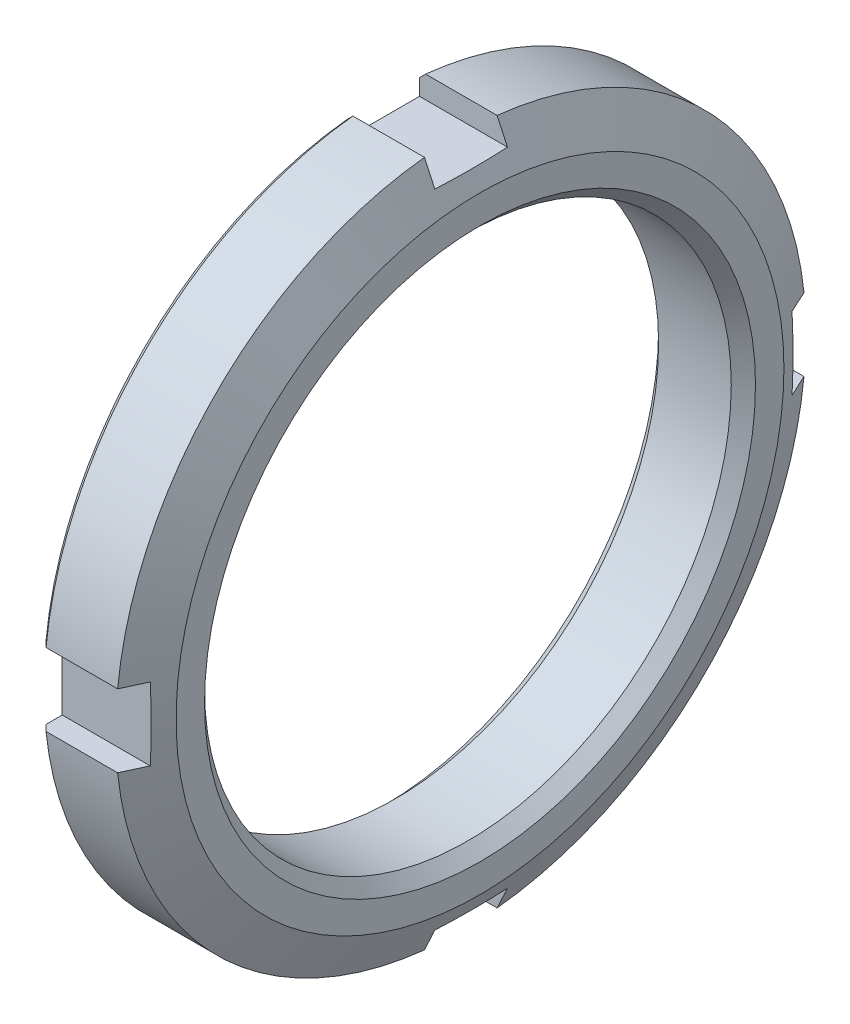
ISO-10303-21;
HEADER;
FILE_DESCRIPTION(('STEP AP214'),'2;1');
FILE_NAME('part.step','',(''),(''),'','','');
FILE_SCHEMA(('AUTOMOTIVE_DESIGN { 1 0 10303 214 1 1 1 1 }'));
ENDSEC;
DATA;
#1=APPLICATION_CONTEXT('core data for automotive mechanical design processes');
#2=APPLICATION_PROTOCOL_DEFINITION('international standard','automotive_design',2000,#1);
#3=PRODUCT_CONTEXT('',#1,'mechanical');
#4=PRODUCT('Part','Part','',(#3));
#5=PRODUCT_RELATED_PRODUCT_CATEGORY('part','',(#4));
#6=PRODUCT_DEFINITION_FORMATION('','',#4);
#7=PRODUCT_DEFINITION_CONTEXT('part definition',#1,'design');
#8=PRODUCT_DEFINITION('design','',#6,#7);
#9=PRODUCT_DEFINITION_SHAPE('','',#8);
#10=(LENGTH_UNIT() NAMED_UNIT(*) SI_UNIT(.MILLI.,.METRE.));
#11=(NAMED_UNIT(*) PLANE_ANGLE_UNIT() SI_UNIT($,.RADIAN.));
#12=(NAMED_UNIT(*) SI_UNIT($,.STERADIAN.) SOLID_ANGLE_UNIT());
#13=UNCERTAINTY_MEASURE_WITH_UNIT(LENGTH_MEASURE(1.E-05),#10,'distance_accuracy_value','');
#14=(GEOMETRIC_REPRESENTATION_CONTEXT(3) GLOBAL_UNCERTAINTY_ASSIGNED_CONTEXT((#13)) GLOBAL_UNIT_ASSIGNED_CONTEXT((#10,
#11,#12)) REPRESENTATION_CONTEXT('',''));
#15=CARTESIAN_POINT('',(0.,0.,0.));
#16=DIRECTION('',(0.,0.,1.));
#17=DIRECTION('',(1.,0.,0.));
#18=AXIS2_PLACEMENT_3D('',#15,#16,#17);
#19=CARTESIAN_POINT('',(8.,0.,0.));
#20=DIRECTION('',(1.,0.,0.));
#21=DIRECTION('',(0.,0.,-1.));
#22=AXIS2_PLACEMENT_3D('',#19,#20,#21);
#23=PLANE('',#22);
#24=CARTESIAN_POINT('',(8.,0.,0.));
#25=DIRECTION('',(1.,0.,0.));
#26=DIRECTION('',(0.,0.,-1.));
#27=AXIS2_PLACEMENT_3D('',#24,#25,#26);
#28=CIRCLE('',#27,22.75);
#29=CARTESIAN_POINT('',(8.,0.,-22.75));
#30=VERTEX_POINT('',#29);
#31=EDGE_CURVE('E282',#30,#30,#28,.F.);
#32=ORIENTED_EDGE('',*,*,#31,.T.);
#33=EDGE_LOOP('',(#32));
#34=FACE_BOUND('',#33,.T.);
#35=CARTESIAN_POINT('',(8.,0.,0.));
#36=DIRECTION('',(1.,0.,0.));
#37=DIRECTION('',(0.,0.,-1.));
#38=AXIS2_PLACEMENT_3D('',#35,#36,#37);
#39=CIRCLE('',#38,25.1);
#40=CARTESIAN_POINT('',(8.,0.,-25.1));
#41=VERTEX_POINT('',#40);
#42=EDGE_CURVE('E743',#41,#41,#39,.T.);
#43=ORIENTED_EDGE('',*,*,#42,.T.);
#44=EDGE_LOOP('',(#43));
#45=FACE_BOUND('',#44,.T.);
#46=ADVANCED_FACE('F39',(#34,#45),#23,.T.);
#47=CARTESIAN_POINT('',(8.,0.,0.));
#48=DIRECTION('',(-1.,0.,0.));
#49=DIRECTION('',(0.,0.,1.));
#50=AXIS2_PLACEMENT_3D('',#47,#48,#49);
#51=CYLINDRICAL_SURFACE('',#50,28.5);
#52=DIRECTION('',(1.,0.,0.));
#53=VECTOR('',#52,1.);
#54=CARTESIAN_POINT('',(0.,-3.0000000000001,-28.3416654415368));
#55=LINE('',#54,#53);
#56=CARTESIAN_POINT('',(0.499999999999997,-3.0000000000001,-28.3416654415368));
#57=VERTEX_POINT('',#56);
#58=CARTESIAN_POINT('',(6.41455396227303,-3.0000000000001,-28.3416654415368));
#59=VERTEX_POINT('',#58);
#60=EDGE_CURVE('E257',#57,#59,#55,.T.);
#61=ORIENTED_EDGE('',*,*,#60,.T.);
#62=CARTESIAN_POINT('',(6.41455396227303,0.,0.));
#63=DIRECTION('',(-1.,0.,0.));
#64=DIRECTION('',(0.,0.,1.));
#65=AXIS2_PLACEMENT_3D('',#62,#63,#64);
#66=CIRCLE('',#65,28.5);
#67=CARTESIAN_POINT('',(6.41455396227303,-28.3416654415368,-3.));
#68=VERTEX_POINT('',#67);
#69=EDGE_CURVE('E195',#59,#68,#66,.T.);
#70=ORIENTED_EDGE('',*,*,#69,.T.);
#71=DIRECTION('',(1.,0.,0.));
#72=VECTOR('',#71,1.);
#73=CARTESIAN_POINT('',(0.,-28.3416654415368,-3.));
#74=LINE('',#73,#72);
#75=CARTESIAN_POINT('',(0.499999999999997,-28.3416654415368,-3.));
#76=VERTEX_POINT('',#75);
#77=EDGE_CURVE('E221',#76,#68,#74,.T.);
#78=ORIENTED_EDGE('',*,*,#77,.F.);
#79=CARTESIAN_POINT('',(0.499999999999997,0.,0.));
#80=DIRECTION('',(1.,0.,0.));
#81=DIRECTION('',(0.,0.,-1.));
#82=AXIS2_PLACEMENT_3D('',#79,#80,#81);
#83=CIRCLE('',#82,28.5);
#84=EDGE_CURVE('E740',#76,#57,#83,.T.);
#85=ORIENTED_EDGE('',*,*,#84,.T.);
#86=EDGE_LOOP('',(#61,#70,#78,#85));
#87=FACE_BOUND('',#86,.T.);
#88=ADVANCED_FACE('F439',(#87),#51,.T.);
#89=DIRECTION('',(1.,0.,0.));
#90=VECTOR('',#89,1.);
#91=CARTESIAN_POINT('',(0.,-28.3416654415368,3.));
#92=LINE('',#91,#90);
#93=CARTESIAN_POINT('',(0.499999999999997,-28.3416654415368,3.));
#94=VERTEX_POINT('',#93);
#95=CARTESIAN_POINT('',(6.41455396227303,-28.3416654415368,3.));
#96=VERTEX_POINT('',#95);
#97=EDGE_CURVE('E222',#94,#96,#92,.T.);
#98=ORIENTED_EDGE('',*,*,#97,.T.);
#99=CARTESIAN_POINT('',(6.41455396227303,0.,0.));
#100=DIRECTION('',(-1.,0.,0.));
#101=DIRECTION('',(0.,0.,1.));
#102=AXIS2_PLACEMENT_3D('',#99,#100,#101);
#103=CIRCLE('',#102,28.5);
#104=CARTESIAN_POINT('',(6.41455396227303,-2.9999999999997,28.3416654415368));
#105=VERTEX_POINT('',#104);
#106=EDGE_CURVE('E424',#96,#105,#103,.T.);
#107=ORIENTED_EDGE('',*,*,#106,.T.);
#108=DIRECTION('',(1.,0.,0.));
#109=VECTOR('',#108,1.);
#110=CARTESIAN_POINT('',(0.,-2.9999999999997,28.3416654415368));
#111=LINE('',#110,#109);
#112=CARTESIAN_POINT('',(0.499999999999999,-2.9999999999997,28.3416654415368));
#113=VERTEX_POINT('',#112);
#114=EDGE_CURVE('E242',#113,#105,#111,.T.);
#115=ORIENTED_EDGE('',*,*,#114,.F.);
#116=EDGE_CURVE('E290',#113,#94,#83,.T.);
#117=ORIENTED_EDGE('',*,*,#116,.T.);
#118=EDGE_LOOP('',(#98,#107,#115,#117));
#119=FACE_BOUND('',#118,.T.);
#120=ADVANCED_FACE('F524',(#119),#51,.T.);
#121=DIRECTION('',(1.,0.,0.));
#122=VECTOR('',#121,1.);
#123=CARTESIAN_POINT('',(0.,3.0000000000003,28.3416654415367));
#124=LINE('',#123,#122);
#125=CARTESIAN_POINT('',(0.499999999999997,3.0000000000003,28.3416654415367));
#126=VERTEX_POINT('',#125);
#127=CARTESIAN_POINT('',(6.41455396227303,3.0000000000003,28.3416654415367));
#128=VERTEX_POINT('',#127);
#129=EDGE_CURVE('E215',#126,#128,#124,.T.);
#130=ORIENTED_EDGE('',*,*,#129,.T.);
#131=CARTESIAN_POINT('',(6.41455396227303,0.,0.));
#132=DIRECTION('',(-1.,0.,0.));
#133=DIRECTION('',(0.,0.,1.));
#134=AXIS2_PLACEMENT_3D('',#131,#132,#133);
#135=CIRCLE('',#134,28.5);
#136=CARTESIAN_POINT('',(6.41455396227303,28.3416654415368,3.));
#137=VERTEX_POINT('',#136);
#138=EDGE_CURVE('E329',#128,#137,#135,.T.);
#139=ORIENTED_EDGE('',*,*,#138,.T.);
#140=DIRECTION('',(1.,0.,0.));
#141=VECTOR('',#140,1.);
#142=CARTESIAN_POINT('',(0.,28.3416654415368,3.));
#143=LINE('',#142,#141);
#144=CARTESIAN_POINT('',(0.499999999999997,28.3416654415368,3.));
#145=VERTEX_POINT('',#144);
#146=EDGE_CURVE('E263',#145,#137,#143,.T.);
#147=ORIENTED_EDGE('',*,*,#146,.F.);
#148=EDGE_CURVE('E286',#145,#126,#83,.T.);
#149=ORIENTED_EDGE('',*,*,#148,.T.);
#150=EDGE_LOOP('',(#130,#139,#147,#149));
#151=FACE_BOUND('',#150,.T.);
#152=ADVANCED_FACE('F532',(#151),#51,.T.);
#153=CARTESIAN_POINT('',(0.499999999999997,0.,0.));
#154=DIRECTION('',(1.,0.,0.));
#155=DIRECTION('',(0.,0.,-1.));
#156=AXIS2_PLACEMENT_3D('',#153,#154,#155);
#157=CONICAL_SURFACE('',#156,28.5,0.785398163397445);
#158=CARTESIAN_POINT('',(2.39859296723593,-3.00000000000011,-30.2501975925395));
#159=CARTESIAN_POINT('',(1.68042286927911,-3.0000000000001,-29.5285494202072));
#160=CARTESIAN_POINT('',(0.962410728423615,-3.0000000000001,-28.8067441895801));
#161=CARTESIAN_POINT('',(-0.473297644324926,-3.0000000000001,-27.362819606466));
#162=CARTESIAN_POINT('',(-1.19099387621566,-3.00000000000009,-26.6407002539767));
#163=CARTESIAN_POINT('',(-1.90853215100277,-3.00000000000009,-25.9184238431903));
#164=B_SPLINE_CURVE_WITH_KNOTS('',3,(#158,#159,#160,#161,#162,#163),.UNSPECIFIED.,.F.,.F.,(4,2,
4),(0.,3.05432447987921,6.10864898205428),.UNSPECIFIED.);
#165=CARTESIAN_POINT('',(0.,-3.0000000000001,-27.8388218141501));
#166=VERTEX_POINT('',#165);
#167=EDGE_CURVE('E55',#57,#166,#164,.T.);
#168=ORIENTED_EDGE('',*,*,#167,.F.);
#169=ORIENTED_EDGE('',*,*,#84,.F.);
#170=CARTESIAN_POINT('',(-1.90853215100277,-25.9184238431903,-3.));
#171=CARTESIAN_POINT('',(-1.19099387621566,-26.6407002539767,-3.));
#172=CARTESIAN_POINT('',(-0.473297644324922,-27.362819606466,-3.));
#173=CARTESIAN_POINT('',(0.962410728423618,-28.8067441895801,-3.));
#174=CARTESIAN_POINT('',(1.68042286927912,-29.5285494202072,-3.));
#175=CARTESIAN_POINT('',(2.39859296723593,-30.2501975925395,-3.));
#176=B_SPLINE_CURVE_WITH_KNOTS('',3,(#170,#171,#172,#173,#174,#175),.UNSPECIFIED.,.F.,.F.,(4,2,
4),(0.,3.05432450217507,6.10864898205428),.UNSPECIFIED.);
#177=CARTESIAN_POINT('',(0.,-27.8388218141501,-3.));
#178=VERTEX_POINT('',#177);
#179=EDGE_CURVE('E445',#178,#76,#176,.T.);
#180=ORIENTED_EDGE('',*,*,#179,.F.);
#181=CARTESIAN_POINT('',(0.,0.,0.));
#182=DIRECTION('',(1.,0.,0.));
#183=DIRECTION('',(0.,0.,-1.));
#184=AXIS2_PLACEMENT_3D('',#181,#182,#183);
#185=CIRCLE('',#184,28.);
#186=EDGE_CURVE('E295',#166,#178,#185,.F.);
#187=ORIENTED_EDGE('',*,*,#186,.F.);
#188=EDGE_LOOP('',(#168,#169,#180,#187));
#189=FACE_BOUND('',#188,.T.);
#190=ADVANCED_FACE('F548',(#189),#157,.T.);
#191=CARTESIAN_POINT('',(2.39859296723593,-30.2501975925395,3.));
#192=CARTESIAN_POINT('',(1.68042286927912,-29.5285494202072,3.));
#193=CARTESIAN_POINT('',(0.962410728423617,-28.8067441895801,3.));
#194=CARTESIAN_POINT('',(-0.473297644324922,-27.362819606466,3.));
#195=CARTESIAN_POINT('',(-1.19099387621566,-26.6407002539767,3.));
#196=CARTESIAN_POINT('',(-1.90853215100277,-25.9184238431903,3.));
#197=B_SPLINE_CURVE_WITH_KNOTS('',3,(#191,#192,#193,#194,#195,#196),.UNSPECIFIED.,.F.,.F.,(4,2,
4),(0.,3.05432447987921,6.10864898205428),.UNSPECIFIED.);
#198=CARTESIAN_POINT('',(0.,-27.8388218141501,3.));
#199=VERTEX_POINT('',#198);
#200=EDGE_CURVE('E449',#94,#199,#197,.T.);
#201=ORIENTED_EDGE('',*,*,#200,.F.);
#202=ORIENTED_EDGE('',*,*,#116,.F.);
#203=CARTESIAN_POINT('',(-1.90853215100277,-2.99999999999973,25.9184238431904));
#204=CARTESIAN_POINT('',(-1.19099387621566,-2.99999999999972,26.6407002539768));
#205=CARTESIAN_POINT('',(-0.473297644324921,-2.99999999999971,27.362819606466));
#206=CARTESIAN_POINT('',(0.962410728423618,-2.9999999999997,28.8067441895801));
#207=CARTESIAN_POINT('',(1.68042286927912,-2.99999999999969,29.5285494202073));
#208=CARTESIAN_POINT('',(2.39859296723593,-2.99999999999968,30.2501975925396));
#209=B_SPLINE_CURVE_WITH_KNOTS('',3,(#203,#204,#205,#206,#207,#208),.UNSPECIFIED.,.F.,.F.,(4,2,
4),(0.,3.05432450217508,6.10864898205428),.UNSPECIFIED.);
#210=CARTESIAN_POINT('',(0.,-2.99999999999971,27.8388218141501));
#211=VERTEX_POINT('',#210);
#212=EDGE_CURVE('E453',#211,#113,#209,.T.);
#213=ORIENTED_EDGE('',*,*,#212,.F.);
#214=EDGE_CURVE('E726',#199,#211,#185,.F.);
#215=ORIENTED_EDGE('',*,*,#214,.F.);
#216=EDGE_LOOP('',(#201,#202,#213,#215));
#217=FACE_BOUND('',#216,.T.);
#218=ADVANCED_FACE('F580',(#217),#157,.T.);
#219=CARTESIAN_POINT('',(2.39859296723593,3.00000000000032,30.2501975925395));
#220=CARTESIAN_POINT('',(1.68042286927912,3.00000000000031,29.5285494202072));
#221=CARTESIAN_POINT('',(0.962410728423616,3.0000000000003,28.8067441895801));
#222=CARTESIAN_POINT('',(-0.473297644324924,3.00000000000029,27.362819606466));
#223=CARTESIAN_POINT('',(-1.19099387621566,3.00000000000028,26.6407002539767));
#224=CARTESIAN_POINT('',(-1.90853215100277,3.00000000000027,25.9184238431903));
#225=B_SPLINE_CURVE_WITH_KNOTS('',3,(#219,#220,#221,#222,#223,#224),.UNSPECIFIED.,.F.,.F.,(4,2,
4),(0.,3.05432447987921,6.10864898205428),.UNSPECIFIED.);
#226=CARTESIAN_POINT('',(0.,3.00000000000029,27.8388218141501));
#227=VERTEX_POINT('',#226);
#228=EDGE_CURVE('E450',#126,#227,#225,.T.);
#229=ORIENTED_EDGE('',*,*,#228,.F.);
#230=ORIENTED_EDGE('',*,*,#148,.F.);
#231=CARTESIAN_POINT('',(-1.90853215100277,25.9184238431903,3.));
#232=CARTESIAN_POINT('',(-1.19099387621566,26.6407002539767,3.));
#233=CARTESIAN_POINT('',(-0.473297644324924,27.362819606466,3.));
#234=CARTESIAN_POINT('',(0.962410728423616,28.8067441895801,3.));
#235=CARTESIAN_POINT('',(1.68042286927912,29.5285494202072,3.));
#236=CARTESIAN_POINT('',(2.39859296723593,30.2501975925395,3.));
#237=B_SPLINE_CURVE_WITH_KNOTS('',3,(#231,#232,#233,#234,#235,#236),.UNSPECIFIED.,.F.,.F.,(4,2,
4),(0.,3.05432450217508,6.10864898205428),.UNSPECIFIED.);
#238=CARTESIAN_POINT('',(0.,27.8388218141501,3.));
#239=VERTEX_POINT('',#238);
#240=EDGE_CURVE('E294',#239,#145,#237,.T.);
#241=ORIENTED_EDGE('',*,*,#240,.F.);
#242=EDGE_CURVE('E289',#227,#239,#185,.F.);
#243=ORIENTED_EDGE('',*,*,#242,.F.);
#244=EDGE_LOOP('',(#229,#230,#241,#243));
#245=FACE_BOUND('',#244,.T.);
#246=ADVANCED_FACE('F529',(#245),#157,.T.);
#247=CARTESIAN_POINT('',(0.,0.,0.));
#248=DIRECTION('',(1.,0.,0.));
#249=DIRECTION('',(0.,0.,-1.));
#250=AXIS2_PLACEMENT_3D('',#247,#248,#249);
#251=PLANE('',#250);
#252=DIRECTION('',(0.,-1.,0.));
#253=VECTOR('',#252,1.);
#254=CARTESIAN_POINT('',(0.,2.99999999999991,-26.5));
#255=LINE('',#254,#253);
#256=CARTESIAN_POINT('',(0.,2.99999999999991,-26.5));
#257=VERTEX_POINT('',#256);
#258=CARTESIAN_POINT('',(0.,-3.00000000000009,-26.5));
#259=VERTEX_POINT('',#258);
#260=EDGE_CURVE('E207',#257,#259,#255,.T.);
#261=ORIENTED_EDGE('',*,*,#260,.T.);
#262=DIRECTION('',(0.,0.,-1.));
#263=VECTOR('',#262,1.);
#264=CARTESIAN_POINT('',(0.,-3.00000000000009,-26.5));
#265=LINE('',#264,#263);
#266=EDGE_CURVE('E202',#259,#166,#265,.T.);
#267=ORIENTED_EDGE('',*,*,#266,.T.);
#268=ORIENTED_EDGE('',*,*,#186,.T.);
#269=DIRECTION('',(0.,1.,0.));
#270=VECTOR('',#269,1.);
#271=CARTESIAN_POINT('',(0.,-28.3416654415368,-3.));
#272=LINE('',#271,#270);
#273=CARTESIAN_POINT('',(0.,-26.5,-3.));
#274=VERTEX_POINT('',#273);
#275=EDGE_CURVE('E211',#178,#274,#272,.T.);
#276=ORIENTED_EDGE('',*,*,#275,.T.);
#277=DIRECTION('',(0.,0.,1.));
#278=VECTOR('',#277,1.);
#279=CARTESIAN_POINT('',(0.,-26.5,-3.));
#280=LINE('',#279,#278);
#281=CARTESIAN_POINT('',(0.,-26.5,3.));
#282=VERTEX_POINT('',#281);
#283=EDGE_CURVE('E214',#274,#282,#280,.T.);
#284=ORIENTED_EDGE('',*,*,#283,.T.);
#285=DIRECTION('',(0.,-1.,0.));
#286=VECTOR('',#285,1.);
#287=CARTESIAN_POINT('',(0.,-26.5,3.));
#288=LINE('',#287,#286);
#289=EDGE_CURVE('E218',#282,#199,#288,.T.);
#290=ORIENTED_EDGE('',*,*,#289,.T.);
#291=ORIENTED_EDGE('',*,*,#214,.T.);
#292=DIRECTION('',(0.,0.,-1.));
#293=VECTOR('',#292,1.);
#294=CARTESIAN_POINT('',(0.,-2.9999999999997,28.3416654415368));
#295=LINE('',#294,#293);
#296=CARTESIAN_POINT('',(0.,-2.99999999999972,26.5));
#297=VERTEX_POINT('',#296);
#298=EDGE_CURVE('E69',#211,#297,#295,.T.);
#299=ORIENTED_EDGE('',*,*,#298,.T.);
#300=DIRECTION('',(0.,1.,0.));
#301=VECTOR('',#300,1.);
#302=CARTESIAN_POINT('',(0.,-2.99999999999972,26.5));
#303=LINE('',#302,#301);
#304=CARTESIAN_POINT('',(0.,3.00000000000028,26.5));
#305=VERTEX_POINT('',#304);
#306=EDGE_CURVE('E235',#297,#305,#303,.T.);
#307=ORIENTED_EDGE('',*,*,#306,.T.);
#308=DIRECTION('',(0.,0.,1.));
#309=VECTOR('',#308,1.);
#310=CARTESIAN_POINT('',(0.,3.00000000000028,26.5));
#311=LINE('',#310,#309);
#312=EDGE_CURVE('E239',#305,#227,#311,.T.);
#313=ORIENTED_EDGE('',*,*,#312,.T.);
#314=ORIENTED_EDGE('',*,*,#242,.T.);
#315=DIRECTION('',(0.,-1.,0.));
#316=VECTOR('',#315,1.);
#317=CARTESIAN_POINT('',(0.,28.3416654415368,3.));
#318=LINE('',#317,#316);
#319=CARTESIAN_POINT('',(0.,26.5,3.));
#320=VERTEX_POINT('',#319);
#321=EDGE_CURVE('E253',#239,#320,#318,.T.);
#322=ORIENTED_EDGE('',*,*,#321,.T.);
#323=DIRECTION('',(0.,0.,-1.));
#324=VECTOR('',#323,1.);
#325=CARTESIAN_POINT('',(0.,26.5,3.));
#326=LINE('',#325,#324);
#327=CARTESIAN_POINT('',(0.,26.5,-3.));
#328=VERTEX_POINT('',#327);
#329=EDGE_CURVE('E256',#320,#328,#326,.T.);
#330=ORIENTED_EDGE('',*,*,#329,.T.);
#331=DIRECTION('',(0.,1.,0.));
#332=VECTOR('',#331,1.);
#333=CARTESIAN_POINT('',(0.,26.5,-3.));
#334=LINE('',#333,#332);
#335=CARTESIAN_POINT('',(0.,27.8388218141501,-3.));
#336=VERTEX_POINT('',#335);
#337=EDGE_CURVE('E260',#328,#336,#334,.T.);
#338=ORIENTED_EDGE('',*,*,#337,.T.);
#339=CARTESIAN_POINT('',(0.,2.9999999999999,-27.8388218141501));
#340=VERTEX_POINT('',#339);
#341=EDGE_CURVE('E291',#336,#340,#185,.F.);
#342=ORIENTED_EDGE('',*,*,#341,.T.);
#343=DIRECTION('',(0.,0.,1.));
#344=VECTOR('',#343,1.);
#345=CARTESIAN_POINT('',(0.,2.9999999999999,-28.3416654415368));
#346=LINE('',#345,#344);
#347=EDGE_CURVE('E225',#340,#257,#346,.T.);
#348=ORIENTED_EDGE('',*,*,#347,.T.);
#349=EDGE_LOOP('',(#261,#267,#268,#276,#284,#290,#291,#299,#307,#313,#314,#322,#330,#338,#342,#348));
#350=FACE_BOUND('',#349,.T.);
#351=CARTESIAN_POINT('',(0.,0.,0.));
#352=DIRECTION('',(1.,0.,0.));
#353=DIRECTION('',(0.,0.,-1.));
#354=AXIS2_PLACEMENT_3D('',#351,#352,#353);
#355=CIRCLE('',#354,22.75);
#356=CARTESIAN_POINT('',(0.,0.,-22.75));
#357=VERTEX_POINT('',#356);
#358=EDGE_CURVE('E265',#357,#357,#355,.T.);
#359=ORIENTED_EDGE('',*,*,#358,.T.);
#360=EDGE_LOOP('',(#359));
#361=FACE_BOUND('',#360,.T.);
#362=ADVANCED_FACE('F496',(#350,#361),#251,.F.);
#363=DIRECTION('',(1.,0.,0.));
#364=VECTOR('',#363,1.);
#365=CARTESIAN_POINT('',(0.,28.3416654415368,-3.));
#366=LINE('',#365,#364);
#367=CARTESIAN_POINT('',(0.499999999999997,28.3416654415368,-3.));
#368=VERTEX_POINT('',#367);
#369=CARTESIAN_POINT('',(6.41455396227303,28.3416654415368,-3.));
#370=VERTEX_POINT('',#369);
#371=EDGE_CURVE('E194',#368,#370,#366,.T.);
#372=ORIENTED_EDGE('',*,*,#371,.T.);
#373=CARTESIAN_POINT('',(6.41455396227303,0.,0.));
#374=DIRECTION('',(-1.,0.,0.));
#375=DIRECTION('',(0.,0.,1.));
#376=AXIS2_PLACEMENT_3D('',#373,#374,#375);
#377=CIRCLE('',#376,28.5);
#378=CARTESIAN_POINT('',(6.41455396227303,2.9999999999999,-28.3416654415368));
#379=VERTEX_POINT('',#378);
#380=EDGE_CURVE('E182',#370,#379,#377,.T.);
#381=ORIENTED_EDGE('',*,*,#380,.T.);
#382=DIRECTION('',(1.,0.,0.));
#383=VECTOR('',#382,1.);
#384=CARTESIAN_POINT('',(0.,2.9999999999999,-28.3416654415368));
#385=LINE('',#384,#383);
#386=CARTESIAN_POINT('',(0.499999999999999,2.9999999999999,-28.3416654415368));
#387=VERTEX_POINT('',#386);
#388=EDGE_CURVE('E191',#387,#379,#385,.T.);
#389=ORIENTED_EDGE('',*,*,#388,.F.);
#390=EDGE_CURVE('E285',#387,#368,#83,.T.);
#391=ORIENTED_EDGE('',*,*,#390,.T.);
#392=EDGE_LOOP('',(#372,#381,#389,#391));
#393=FACE_BOUND('',#392,.T.);
#394=ADVANCED_FACE('F190',(#393),#51,.T.);
#395=CARTESIAN_POINT('',(8.,0.,0.));
#396=DIRECTION('',(-1.,0.,0.));
#397=DIRECTION('',(0.,0.,1.));
#398=AXIS2_PLACEMENT_3D('',#395,#396,#397);
#399=CYLINDRICAL_SURFACE('',#398,21.75);
#400=CARTESIAN_POINT('',(1.,0.,0.));
#401=DIRECTION('',(1.,0.,0.));
#402=DIRECTION('',(0.,0.,-1.));
#403=AXIS2_PLACEMENT_3D('',#400,#401,#402);
#404=CIRCLE('',#403,21.75);
#405=CARTESIAN_POINT('',(1.,0.,-21.75));
#406=VERTEX_POINT('',#405);
#407=EDGE_CURVE('E279',#406,#406,#404,.F.);
#408=ORIENTED_EDGE('',*,*,#407,.T.);
#409=EDGE_LOOP('',(#408));
#410=FACE_BOUND('',#409,.T.);
#411=CARTESIAN_POINT('',(6.99999999999999,0.,0.));
#412=DIRECTION('',(1.,0.,0.));
#413=DIRECTION('',(0.,0.,-1.));
#414=AXIS2_PLACEMENT_3D('',#411,#412,#413);
#415=CIRCLE('',#414,21.75);
#416=CARTESIAN_POINT('',(6.99999999999999,0.,-21.75));
#417=VERTEX_POINT('',#416);
#418=EDGE_CURVE('E276',#417,#417,#415,.T.);
#419=ORIENTED_EDGE('',*,*,#418,.T.);
#420=EDGE_LOOP('',(#419));
#421=FACE_BOUND('',#420,.T.);
#422=ADVANCED_FACE('F318',(#410,#421),#399,.F.);
#423=CARTESIAN_POINT('',(0.,0.,0.));
#424=DIRECTION('',(-1.,0.,0.));
#425=DIRECTION('',(0.,0.,1.));
#426=AXIS2_PLACEMENT_3D('',#423,#424,#425);
#427=CONICAL_SURFACE('',#426,22.75,0.785398163397448);
#428=ORIENTED_EDGE('',*,*,#407,.F.);
#429=EDGE_LOOP('',(#428));
#430=FACE_BOUND('',#429,.T.);
#431=ORIENTED_EDGE('',*,*,#358,.F.);
#432=EDGE_LOOP('',(#431));
#433=FACE_BOUND('',#432,.T.);
#434=ADVANCED_FACE('F534',(#430,#433),#427,.F.);
#435=CARTESIAN_POINT('',(6.99999999999999,0.,0.));
#436=DIRECTION('',(1.,0.,0.));
#437=DIRECTION('',(0.,0.,-1.));
#438=AXIS2_PLACEMENT_3D('',#435,#436,#437);
#439=CONICAL_SURFACE('',#438,21.75,0.785398163397448);
#440=ORIENTED_EDGE('',*,*,#31,.F.);
#441=EDGE_LOOP('',(#440));
#442=FACE_BOUND('',#441,.T.);
#443=ORIENTED_EDGE('',*,*,#418,.F.);
#444=EDGE_LOOP('',(#443));
#445=FACE_BOUND('',#444,.T.);
#446=ADVANCED_FACE('F539',(#442,#445),#439,.F.);
#447=CARTESIAN_POINT('',(-1.90853215100277,2.99999999999991,-25.9184238431903));
#448=CARTESIAN_POINT('',(-1.19099387621566,2.99999999999991,-26.6407002539767));
#449=CARTESIAN_POINT('',(-0.473297644324924,2.9999999999999,-27.362819606466));
#450=CARTESIAN_POINT('',(0.962410728423616,2.9999999999999,-28.8067441895801));
#451=CARTESIAN_POINT('',(1.68042286927911,2.9999999999999,-29.5285494202072));
#452=CARTESIAN_POINT('',(2.39859296723593,2.99999999999989,-30.2501975925396));
#453=B_SPLINE_CURVE_WITH_KNOTS('',3,(#447,#448,#449,#450,#451,#452),.UNSPECIFIED.,.F.,.F.,(4,2,
4),(0.,3.05432450217508,6.10864898205428),.UNSPECIFIED.);
#454=EDGE_CURVE('E200',#340,#387,#453,.T.);
#455=ORIENTED_EDGE('',*,*,#454,.F.);
#456=ORIENTED_EDGE('',*,*,#341,.F.);
#457=CARTESIAN_POINT('',(2.39859296723593,30.2501975925395,-3.));
#458=CARTESIAN_POINT('',(1.68042286927912,29.5285494202072,-3.));
#459=CARTESIAN_POINT('',(0.962410728423618,28.8067441895801,-3.));
#460=CARTESIAN_POINT('',(-0.473297644324922,27.362819606466,-3.));
#461=CARTESIAN_POINT('',(-1.19099387621566,26.6407002539767,-3.));
#462=CARTESIAN_POINT('',(-1.90853215100277,25.9184238431903,-3.));
#463=B_SPLINE_CURVE_WITH_KNOTS('',3,(#457,#458,#459,#460,#461,#462),.UNSPECIFIED.,.F.,.F.,(4,2,
4),(0.,3.05432447987921,6.10864898205428),.UNSPECIFIED.);
#464=EDGE_CURVE('E302',#368,#336,#463,.T.);
#465=ORIENTED_EDGE('',*,*,#464,.F.);
#466=ORIENTED_EDGE('',*,*,#390,.F.);
#467=EDGE_LOOP('',(#455,#456,#465,#466));
#468=FACE_BOUND('',#467,.T.);
#469=ADVANCED_FACE('F42',(#468),#157,.T.);
#470=CARTESIAN_POINT('',(0.,26.5,-3.));
#471=DIRECTION('',(0.,0.,-1.));
#472=DIRECTION('',(-1.,0.,0.));
#473=AXIS2_PLACEMENT_3D('',#470,#471,#472);
#474=PLANE('',#473);
#475=DIRECTION('',(1.,0.,0.));
#476=VECTOR('',#475,1.);
#477=CARTESIAN_POINT('',(0.,26.5,-3.));
#478=LINE('',#477,#476);
#479=CARTESIAN_POINT('',(7.2682370519857,26.5,-3.));
#480=VERTEX_POINT('',#479);
#481=EDGE_CURVE('E266',#328,#480,#478,.T.);
#482=ORIENTED_EDGE('',*,*,#481,.T.);
#483=CARTESIAN_POINT('',(9.60590595616549,21.4473235577214,-3.));
#484=CARTESIAN_POINT('',(9.14583146659231,22.4435041791488,-3.));
#485=CARTESIAN_POINT('',(8.68529614418647,23.4394717494745,-3.));
#486=CARTESIAN_POINT('',(7.76352632705616,25.4310829956941,-3.));
#487=CARTESIAN_POINT('',(7.30229183252299,26.4267266716765,-3.));
#488=CARTESIAN_POINT('',(6.37934598485059,28.4177927258734,-3.));
#489=CARTESIAN_POINT('',(5.91763463178609,29.4132151041224,-3.));
#490=CARTESIAN_POINT('',(4.99384862445175,31.4038916013786,-3.));
#491=CARTESIAN_POINT('',(4.53177397008445,32.3991457203407,-3.));
#492=CARTESIAN_POINT('',(4.06957460378079,33.3943418838154,-3.));
#493=B_SPLINE_CURVE_WITH_KNOTS('',3,(#483,#484,#485,#486,#487,#488,#489,#490,#491,#492),
.UNSPECIFIED.,.F.,.F.,(4,2,2,2,4),(0.,3.29186826145227,6.58373562240218,9.87560246747063,
13.1674701957959),.UNSPECIFIED.);
#494=EDGE_CURVE('E382',#480,#370,#493,.T.);
#495=ORIENTED_EDGE('',*,*,#494,.T.);
#496=ORIENTED_EDGE('',*,*,#371,.F.);
#497=ORIENTED_EDGE('',*,*,#464,.T.);
#498=ORIENTED_EDGE('',*,*,#337,.F.);
#499=EDGE_LOOP('',(#482,#495,#496,#497,#498));
#500=FACE_BOUND('',#499,.T.);
#501=ADVANCED_FACE('F483',(#500),#474,.F.);
#502=CARTESIAN_POINT('',(0.,26.5,3.));
#503=DIRECTION('',(0.,-1.,0.));
#504=DIRECTION('',(0.,0.,-1.));
#505=AXIS2_PLACEMENT_3D('',#502,#503,#504);
#506=PLANE('',#505);
#507=DIRECTION('',(1.,0.,0.));
#508=VECTOR('',#507,1.);
#509=CARTESIAN_POINT('',(0.,26.5,3.));
#510=LINE('',#509,#508);
#511=CARTESIAN_POINT('',(7.2682370519857,26.5,3.));
#512=VERTEX_POINT('',#511);
#513=EDGE_CURVE('E269',#320,#512,#510,.T.);
#514=ORIENTED_EDGE('',*,*,#513,.T.);
#515=CARTESIAN_POINT('',(6.39094758662084,26.5,10.6248827213485));
#516=CARTESIAN_POINT('',(6.46732861081357,26.5,10.1847375768386));
#517=CARTESIAN_POINT('',(6.53973569092069,26.5,9.74390809439767));
#518=CARTESIAN_POINT('',(6.67611351220827,26.5,8.86092320838128));
#519=CARTESIAN_POINT('',(6.7400837967314,26.5,8.4187677343577));
#520=CARTESIAN_POINT('',(6.91863002153529,26.5,7.09018674451034));
#521=CARTESIAN_POINT('',(7.01979567526112,26.5,6.20190648404812));
#522=CARTESIAN_POINT('',(7.18228361852321,26.5,4.42888447905261));
#523=CARTESIAN_POINT('',(7.24391922625499,26.5,3.54417156907014));
#524=CARTESIAN_POINT('',(7.32635846171519,26.5,1.77297221286959));
#525=CARTESIAN_POINT('',(7.34716927858301,26.5,0.886486106434794));
#526=CARTESIAN_POINT('',(7.34716927858301,26.5,-0.886486106434794));
#527=CARTESIAN_POINT('',(7.32635846171519,26.5,-1.77297221286959));
#528=CARTESIAN_POINT('',(7.24391922625499,26.5,-3.54417156907014));
#529=CARTESIAN_POINT('',(7.18228361852321,26.5,-4.42888447905261));
#530=CARTESIAN_POINT('',(7.01979567526112,26.5,-6.20190648404811));
#531=CARTESIAN_POINT('',(6.91863002153529,26.5,-7.09018674451034));
#532=CARTESIAN_POINT('',(6.7400837967314,26.5,-8.4187677343577));
#533=CARTESIAN_POINT('',(6.67611351220827,26.5,-8.86092320838128));
#534=CARTESIAN_POINT('',(6.53973569092069,26.5,-9.74390809439767));
#535=CARTESIAN_POINT('',(6.46732861081357,26.5,-10.1847375768386));
#536=CARTESIAN_POINT('',(6.39094758662084,26.5,-10.6248827213485));
#537=B_SPLINE_CURVE_WITH_KNOTS('',3,(#515,#516,#517,#518,#519,#520,#521,#522,#523,#524,#525,
#526,#527,#528,#529,#530,#531,#532,#533,#534,#535,#536),.UNSPECIFIED.,.F.,.F.,(4,2,2,2,2,2,2,2,
2,2,4),(0.,1.34013648079104,2.68034546923096,5.36155430657708,8.0212401061313,10.6804574998797,
13.339674893628,15.9993606931823,18.6805695305284,20.0207785189683,21.3609149997593),.UNSPECIFIED.);
#538=EDGE_CURVE('E411',#512,#480,#537,.T.);
#539=ORIENTED_EDGE('',*,*,#538,.T.);
#540=ORIENTED_EDGE('',*,*,#481,.F.);
#541=ORIENTED_EDGE('',*,*,#329,.F.);
#542=EDGE_LOOP('',(#514,#539,#540,#541));
#543=FACE_BOUND('',#542,.T.);
#544=ADVANCED_FACE('F315',(#543),#506,.F.);
#545=CARTESIAN_POINT('',(0.,28.3416654415368,3.));
#546=DIRECTION('',(0.,0.,1.));
#547=DIRECTION('',(1.,0.,0.));
#548=AXIS2_PLACEMENT_3D('',#545,#546,#547);
#549=PLANE('',#548);
#550=ORIENTED_EDGE('',*,*,#146,.T.);
#551=CARTESIAN_POINT('',(4.06957460378079,33.3943418838154,3.));
#552=CARTESIAN_POINT('',(4.53177397008445,32.3991457203407,3.));
#553=CARTESIAN_POINT('',(4.99384862445175,31.4038916013786,3.));
#554=CARTESIAN_POINT('',(5.91763463178609,29.4132151041224,3.));
#555=CARTESIAN_POINT('',(6.37934598485059,28.4177927258734,3.));
#556=CARTESIAN_POINT('',(7.30229183252299,26.4267266716765,3.));
#557=CARTESIAN_POINT('',(7.76352632705616,25.4310829956941,3.));
#558=CARTESIAN_POINT('',(8.68529614418647,23.4394717494745,3.));
#559=CARTESIAN_POINT('',(9.14583146659231,22.4435041791488,3.));
#560=CARTESIAN_POINT('',(9.6059059561655,21.4473235577214,3.));
#561=B_SPLINE_CURVE_WITH_KNOTS('',3,(#551,#552,#553,#554,#555,#556,#557,#558,#559,#560),
.UNSPECIFIED.,.F.,.F.,(4,2,2,2,4),(0.,3.29186772832527,6.58373457339372,9.87560193434363,
13.1674701957959),.UNSPECIFIED.);
#562=EDGE_CURVE('E236',#137,#512,#561,.T.);
#563=ORIENTED_EDGE('',*,*,#562,.T.);
#564=ORIENTED_EDGE('',*,*,#513,.F.);
#565=ORIENTED_EDGE('',*,*,#321,.F.);
#566=ORIENTED_EDGE('',*,*,#240,.T.);
#567=EDGE_LOOP('',(#550,#563,#564,#565,#566));
#568=FACE_BOUND('',#567,.T.);
#569=ADVANCED_FACE('F309',(#568),#549,.F.);
#570=CARTESIAN_POINT('',(0.,3.00000000000028,26.5));
#571=DIRECTION('',(0.,1.,0.));
#572=DIRECTION('',(0.,0.,1.));
#573=AXIS2_PLACEMENT_3D('',#570,#571,#572);
#574=PLANE('',#573);
#575=DIRECTION('',(1.,0.,0.));
#576=VECTOR('',#575,1.);
#577=CARTESIAN_POINT('',(0.,3.00000000000028,26.5));
#578=LINE('',#577,#576);
#579=CARTESIAN_POINT('',(7.2682370519857,3.00000000000028,26.5));
#580=VERTEX_POINT('',#579);
#581=EDGE_CURVE('E245',#305,#580,#578,.T.);
#582=ORIENTED_EDGE('',*,*,#581,.T.);
#583=CARTESIAN_POINT('',(9.60590595616549,3.00000000000022,21.4473235577213));
#584=CARTESIAN_POINT('',(9.14583146659231,3.00000000000023,22.4435041791488));
#585=CARTESIAN_POINT('',(8.68529614418646,3.00000000000025,23.4394717494744));
#586=CARTESIAN_POINT('',(7.76352632705616,3.00000000000027,25.431082995694));
#587=CARTESIAN_POINT('',(7.30229183252299,3.00000000000028,26.4267266716765));
#588=CARTESIAN_POINT('',(6.37934598485059,3.0000000000003,28.4177927258733));
#589=CARTESIAN_POINT('',(5.91763463178609,3.00000000000031,29.4132151041223));
#590=CARTESIAN_POINT('',(4.99384862445175,3.00000000000033,31.4038916013786));
#591=CARTESIAN_POINT('',(4.53177397008445,3.00000000000034,32.3991457203407));
#592=CARTESIAN_POINT('',(4.06957460378079,3.00000000000035,33.3943418838154));
#593=B_SPLINE_CURVE_WITH_KNOTS('',3,(#583,#584,#585,#586,#587,#588,#589,#590,#591,#592),
.UNSPECIFIED.,.F.,.F.,(4,2,2,2,4),(0.,3.29186826145227,6.58373562240218,9.87560246747063,
13.1674701957959),.UNSPECIFIED.);
#594=EDGE_CURVE('E405',#580,#128,#593,.T.);
#595=ORIENTED_EDGE('',*,*,#594,.T.);
#596=ORIENTED_EDGE('',*,*,#129,.F.);
#597=ORIENTED_EDGE('',*,*,#228,.T.);
#598=ORIENTED_EDGE('',*,*,#312,.F.);
#599=EDGE_LOOP('',(#582,#595,#596,#597,#598));
#600=FACE_BOUND('',#599,.T.);
#601=ADVANCED_FACE('F314',(#600),#574,.F.);
#602=CARTESIAN_POINT('',(0.,-2.99999999999972,26.5));
#603=DIRECTION('',(0.,0.,-1.));
#604=DIRECTION('',(0.,1.,0.));
#605=AXIS2_PLACEMENT_3D('',#602,#603,#604);
#606=PLANE('',#605);
#607=DIRECTION('',(1.,0.,0.));
#608=VECTOR('',#607,1.);
#609=CARTESIAN_POINT('',(0.,-2.99999999999972,26.5));
#610=LINE('',#609,#608);
#611=CARTESIAN_POINT('',(7.2682370519857,-2.99999999999972,26.5));
#612=VERTEX_POINT('',#611);
#613=EDGE_CURVE('E248',#297,#612,#610,.T.);
#614=ORIENTED_EDGE('',*,*,#613,.T.);
#615=CARTESIAN_POINT('',(6.39094758662084,-10.6248827213482,26.5000000000001));
#616=CARTESIAN_POINT('',(6.46732861081357,-10.1847375768383,26.5000000000001));
#617=CARTESIAN_POINT('',(6.53973569092069,-9.7439080943974,26.5000000000001));
#618=CARTESIAN_POINT('',(6.67611351220827,-8.860923208381,26.5000000000001));
#619=CARTESIAN_POINT('',(6.7400837967314,-8.41876773435743,26.5000000000001));
#620=CARTESIAN_POINT('',(6.91863002153529,-7.09018674451006,26.5000000000001));
#621=CARTESIAN_POINT('',(7.01979567526112,-6.20190648404784,26.5000000000001));
#622=CARTESIAN_POINT('',(7.18228361852321,-4.42888447905233,26.5));
#623=CARTESIAN_POINT('',(7.24391922625499,-3.54417156906987,26.5));
#624=CARTESIAN_POINT('',(7.32635846171519,-1.77297221286931,26.5));
#625=CARTESIAN_POINT('',(7.34716927858301,-0.886486106434517,26.5));
#626=CARTESIAN_POINT('',(7.34716927858301,0.88648610643507,26.5));
#627=CARTESIAN_POINT('',(7.32635846171519,1.77297221286986,26.5));
#628=CARTESIAN_POINT('',(7.24391922625499,3.54417156907042,26.5));
#629=CARTESIAN_POINT('',(7.18228361852321,4.42888447905288,26.5));
#630=CARTESIAN_POINT('',(7.01979567526112,6.20190648404839,26.4999999999999));
#631=CARTESIAN_POINT('',(6.91863002153529,7.09018674451062,26.4999999999999));
#632=CARTESIAN_POINT('',(6.7400837967314,8.41876773435798,26.4999999999999));
#633=CARTESIAN_POINT('',(6.67611351220827,8.86092320838155,26.4999999999999));
#634=CARTESIAN_POINT('',(6.53973569092069,9.74390809439795,26.4999999999999));
#635=CARTESIAN_POINT('',(6.46732861081357,10.1847375768389,26.4999999999999));
#636=CARTESIAN_POINT('',(6.39094758662085,10.6248827213487,26.4999999999999));
#637=B_SPLINE_CURVE_WITH_KNOTS('',3,(#615,#616,#617,#618,#619,#620,#621,#622,#623,#624,#625,
#626,#627,#628,#629,#630,#631,#632,#633,#634,#635,#636),.UNSPECIFIED.,.F.,.F.,(4,2,2,2,2,2,2,2,
2,2,4),(0.,1.34013648079104,2.68034546923096,5.36155430657708,8.0212401061313,10.6804574998797,
13.339674893628,15.9993606931823,18.6805695305284,20.0207785189683,21.3609149997593),.UNSPECIFIED.);
#638=EDGE_CURVE('E398',#612,#580,#637,.T.);
#639=ORIENTED_EDGE('',*,*,#638,.T.);
#640=ORIENTED_EDGE('',*,*,#581,.F.);
#641=ORIENTED_EDGE('',*,*,#306,.F.);
#642=EDGE_LOOP('',(#614,#639,#640,#641));
#643=FACE_BOUND('',#642,.T.);
#644=ADVANCED_FACE('F475',(#643),#606,.F.);
#645=CARTESIAN_POINT('',(0.,-2.9999999999997,28.3416654415368));
#646=DIRECTION('',(0.,-1.,0.));
#647=DIRECTION('',(0.,0.,-1.));
#648=AXIS2_PLACEMENT_3D('',#645,#646,#647);
#649=PLANE('',#648);
#650=ORIENTED_EDGE('',*,*,#114,.T.);
#651=CARTESIAN_POINT('',(4.06957460378079,-2.99999999999965,33.3943418838154));
#652=CARTESIAN_POINT('',(4.53177397008445,-2.99999999999966,32.3991457203407));
#653=CARTESIAN_POINT('',(4.99384862445175,-2.99999999999967,31.4038916013787));
#654=CARTESIAN_POINT('',(5.91763463178609,-2.99999999999969,29.4132151041224));
#655=CARTESIAN_POINT('',(6.37934598485059,-2.9999999999997,28.4177927258734));
#656=CARTESIAN_POINT('',(7.30229183252299,-2.99999999999972,26.4267266716766));
#657=CARTESIAN_POINT('',(7.76352632705616,-2.99999999999973,25.4310829956941));
#658=CARTESIAN_POINT('',(8.68529614418647,-2.99999999999975,23.4394717494745));
#659=CARTESIAN_POINT('',(9.14583146659231,-2.99999999999976,22.4435041791489));
#660=CARTESIAN_POINT('',(9.60590595616549,-2.99999999999978,21.4473235577214));
#661=B_SPLINE_CURVE_WITH_KNOTS('',3,(#651,#652,#653,#654,#655,#656,#657,#658,#659,#660),
.UNSPECIFIED.,.F.,.F.,(4,2,2,2,4),(0.,3.29186772832527,6.58373457339372,9.87560193434364,
13.1674701957959),.UNSPECIFIED.);
#662=EDGE_CURVE('E390',#105,#612,#661,.T.);
#663=ORIENTED_EDGE('',*,*,#662,.T.);
#664=ORIENTED_EDGE('',*,*,#613,.F.);
#665=ORIENTED_EDGE('',*,*,#298,.F.);
#666=ORIENTED_EDGE('',*,*,#212,.T.);
#667=EDGE_LOOP('',(#650,#663,#664,#665,#666));
#668=FACE_BOUND('',#667,.T.);
#669=ADVANCED_FACE('F479',(#668),#649,.F.);
#670=CARTESIAN_POINT('',(0.,-26.5,3.));
#671=DIRECTION('',(0.,0.,1.));
#672=DIRECTION('',(1.,0.,0.));
#673=AXIS2_PLACEMENT_3D('',#670,#671,#672);
#674=PLANE('',#673);
#675=DIRECTION('',(1.,0.,0.));
#676=VECTOR('',#675,1.);
#677=CARTESIAN_POINT('',(0.,-26.5,3.));
#678=LINE('',#677,#676);
#679=CARTESIAN_POINT('',(7.2682370519857,-26.5,3.));
#680=VERTEX_POINT('',#679);
#681=EDGE_CURVE('E226',#282,#680,#678,.T.);
#682=ORIENTED_EDGE('',*,*,#681,.T.);
#683=CARTESIAN_POINT('',(9.6059059561655,-21.4473235577214,3.));
#684=CARTESIAN_POINT('',(9.14583146659231,-22.4435041791488,3.));
#685=CARTESIAN_POINT('',(8.68529614418647,-23.4394717494745,3.));
#686=CARTESIAN_POINT('',(7.76352632705616,-25.4310829956941,3.));
#687=CARTESIAN_POINT('',(7.30229183252299,-26.4267266716765,3.));
#688=CARTESIAN_POINT('',(6.37934598485059,-28.4177927258734,3.));
#689=CARTESIAN_POINT('',(5.91763463178609,-29.4132151041224,3.));
#690=CARTESIAN_POINT('',(4.99384862445175,-31.4038916013786,3.));
#691=CARTESIAN_POINT('',(4.53177397008445,-32.3991457203407,3.));
#692=CARTESIAN_POINT('',(4.06957460378079,-33.3943418838154,3.));
#693=B_SPLINE_CURVE_WITH_KNOTS('',3,(#683,#684,#685,#686,#687,#688,#689,#690,#691,#692),
.UNSPECIFIED.,.F.,.F.,(4,2,2,2,4),(0.,3.29186826145227,6.58373562240218,9.87560246747063,
13.1674701957959),.UNSPECIFIED.);
#694=EDGE_CURVE('E374',#680,#96,#693,.T.);
#695=ORIENTED_EDGE('',*,*,#694,.T.);
#696=ORIENTED_EDGE('',*,*,#97,.F.);
#697=ORIENTED_EDGE('',*,*,#200,.T.);
#698=ORIENTED_EDGE('',*,*,#289,.F.);
#699=EDGE_LOOP('',(#682,#695,#696,#697,#698));
#700=FACE_BOUND('',#699,.T.);
#701=ADVANCED_FACE('F482',(#700),#674,.F.);
#702=CARTESIAN_POINT('',(0.,-26.5,-3.));
#703=DIRECTION('',(0.,1.,0.));
#704=DIRECTION('',(0.,0.,1.));
#705=AXIS2_PLACEMENT_3D('',#702,#703,#704);
#706=PLANE('',#705);
#707=DIRECTION('',(1.,0.,0.));
#708=VECTOR('',#707,1.);
#709=CARTESIAN_POINT('',(0.,-26.5,-3.));
#710=LINE('',#709,#708);
#711=CARTESIAN_POINT('',(7.2682370519857,-26.5,-3.));
#712=VERTEX_POINT('',#711);
#713=EDGE_CURVE('E229',#274,#712,#710,.T.);
#714=ORIENTED_EDGE('',*,*,#713,.T.);
#715=CARTESIAN_POINT('',(6.39094758662084,-26.5,-10.6248827213485));
#716=CARTESIAN_POINT('',(6.46732861081357,-26.5,-10.1847375768386));
#717=CARTESIAN_POINT('',(6.53973569092069,-26.5,-9.74390809439767));
#718=CARTESIAN_POINT('',(6.67611351220827,-26.5,-8.86092320838128));
#719=CARTESIAN_POINT('',(6.7400837967314,-26.5,-8.4187677343577));
#720=CARTESIAN_POINT('',(6.91863002153529,-26.5,-7.09018674451034));
#721=CARTESIAN_POINT('',(7.01979567526112,-26.5,-6.20190648404812));
#722=CARTESIAN_POINT('',(7.18228361852321,-26.5,-4.42888447905261));
#723=CARTESIAN_POINT('',(7.24391922625499,-26.5,-3.54417156907014));
#724=CARTESIAN_POINT('',(7.32635846171519,-26.5,-1.77297221286959));
#725=CARTESIAN_POINT('',(7.34716927858301,-26.5,-0.886486106434794));
#726=CARTESIAN_POINT('',(7.34716927858301,-26.5,0.886486106434794));
#727=CARTESIAN_POINT('',(7.32635846171519,-26.5,1.77297221286959));
#728=CARTESIAN_POINT('',(7.24391922625499,-26.5,3.54417156907014));
#729=CARTESIAN_POINT('',(7.18228361852321,-26.5,4.42888447905261));
#730=CARTESIAN_POINT('',(7.01979567526112,-26.5,6.20190648404811));
#731=CARTESIAN_POINT('',(6.91863002153529,-26.5,7.09018674451034));
#732=CARTESIAN_POINT('',(6.7400837967314,-26.5,8.4187677343577));
#733=CARTESIAN_POINT('',(6.67611351220827,-26.5,8.86092320838128));
#734=CARTESIAN_POINT('',(6.53973569092069,-26.5,9.74390809439767));
#735=CARTESIAN_POINT('',(6.46732861081357,-26.5,10.1847375768386));
#736=CARTESIAN_POINT('',(6.39094758662084,-26.5,10.6248827213485));
#737=B_SPLINE_CURVE_WITH_KNOTS('',3,(#715,#716,#717,#718,#719,#720,#721,#722,#723,#724,#725,
#726,#727,#728,#729,#730,#731,#732,#733,#734,#735,#736),.UNSPECIFIED.,.F.,.F.,(4,2,2,2,2,2,2,2,
2,2,4),(0.,1.34013648079104,2.68034546923096,5.36155430657708,8.0212401061313,10.6804574998797,
13.339674893628,15.9993606931823,18.6805695305284,20.0207785189683,21.3609149997593),.UNSPECIFIED.);
#738=EDGE_CURVE('E366',#712,#680,#737,.T.);
#739=ORIENTED_EDGE('',*,*,#738,.T.);
#740=ORIENTED_EDGE('',*,*,#681,.F.);
#741=ORIENTED_EDGE('',*,*,#283,.F.);
#742=EDGE_LOOP('',(#714,#739,#740,#741));
#743=FACE_BOUND('',#742,.T.);
#744=ADVANCED_FACE('F470',(#743),#706,.F.);
#745=CARTESIAN_POINT('',(0.,-28.3416654415368,-3.));
#746=DIRECTION('',(0.,0.,-1.));
#747=DIRECTION('',(-1.,0.,0.));
#748=AXIS2_PLACEMENT_3D('',#745,#746,#747);
#749=PLANE('',#748);
#750=ORIENTED_EDGE('',*,*,#77,.T.);
#751=CARTESIAN_POINT('',(4.06957460378079,-33.3943418838154,-3.));
#752=CARTESIAN_POINT('',(4.53177397008445,-32.3991457203407,-3.));
#753=CARTESIAN_POINT('',(4.99384862445175,-31.4038916013786,-3.));
#754=CARTESIAN_POINT('',(5.91763463178609,-29.4132151041224,-3.));
#755=CARTESIAN_POINT('',(6.37934598485059,-28.4177927258734,-3.));
#756=CARTESIAN_POINT('',(7.30229183252299,-26.4267266716765,-3.));
#757=CARTESIAN_POINT('',(7.76352632705616,-25.4310829956941,-3.));
#758=CARTESIAN_POINT('',(8.68529614418647,-23.4394717494745,-3.));
#759=CARTESIAN_POINT('',(9.14583146659231,-22.4435041791488,-3.));
#760=CARTESIAN_POINT('',(9.6059059561655,-21.4473235577214,-3.));
#761=B_SPLINE_CURVE_WITH_KNOTS('',3,(#751,#752,#753,#754,#755,#756,#757,#758,#759,#760),
.UNSPECIFIED.,.F.,.F.,(4,2,2,2,4),(0.,3.29186772832527,6.58373457339372,9.87560193434363,
13.1674701957959),.UNSPECIFIED.);
#762=EDGE_CURVE('E357',#68,#712,#761,.T.);
#763=ORIENTED_EDGE('',*,*,#762,.T.);
#764=ORIENTED_EDGE('',*,*,#713,.F.);
#765=ORIENTED_EDGE('',*,*,#275,.F.);
#766=ORIENTED_EDGE('',*,*,#179,.T.);
#767=EDGE_LOOP('',(#750,#763,#764,#765,#766));
#768=FACE_BOUND('',#767,.T.);
#769=ADVANCED_FACE('F443',(#768),#749,.F.);
#770=CARTESIAN_POINT('',(0.,-3.00000000000009,-26.5));
#771=DIRECTION('',(0.,-1.,0.));
#772=DIRECTION('',(0.,0.,-1.));
#773=AXIS2_PLACEMENT_3D('',#770,#771,#772);
#774=PLANE('',#773);
#775=DIRECTION('',(1.,0.,0.));
#776=VECTOR('',#775,1.);
#777=CARTESIAN_POINT('',(0.,-3.00000000000009,-26.5));
#778=LINE('',#777,#776);
#779=CARTESIAN_POINT('',(7.2682370519857,-3.00000000000009,-26.5));
#780=VERTEX_POINT('',#779);
#781=EDGE_CURVE('E204',#259,#780,#778,.T.);
#782=ORIENTED_EDGE('',*,*,#781,.T.);
#783=CARTESIAN_POINT('',(9.60590595616549,-3.00000000000007,-21.4473235577214));
#784=CARTESIAN_POINT('',(9.14583146659231,-3.00000000000008,-22.4435041791488));
#785=CARTESIAN_POINT('',(8.68529614418646,-3.00000000000008,-23.4394717494745));
#786=CARTESIAN_POINT('',(7.76352632705616,-3.00000000000009,-25.431082995694));
#787=CARTESIAN_POINT('',(7.30229183252299,-3.00000000000009,-26.4267266716765));
#788=CARTESIAN_POINT('',(6.37934598485059,-3.0000000000001,-28.4177927258734));
#789=CARTESIAN_POINT('',(5.91763463178609,-3.0000000000001,-29.4132151041224));
#790=CARTESIAN_POINT('',(4.99384862445175,-3.00000000000011,-31.4038916013786));
#791=CARTESIAN_POINT('',(4.53177397008445,-3.00000000000011,-32.3991457203407));
#792=CARTESIAN_POINT('',(4.06957460378079,-3.00000000000012,-33.3943418838154));
#793=B_SPLINE_CURVE_WITH_KNOTS('',3,(#783,#784,#785,#786,#787,#788,#789,#790,#791,#792),
.UNSPECIFIED.,.F.,.F.,(4,2,2,2,4),(0.,3.29186826145227,6.58373562240218,9.87560246747063,
13.1674701957959),.UNSPECIFIED.);
#794=EDGE_CURVE('E196',#780,#59,#793,.T.);
#795=ORIENTED_EDGE('',*,*,#794,.T.);
#796=ORIENTED_EDGE('',*,*,#60,.F.);
#797=ORIENTED_EDGE('',*,*,#167,.T.);
#798=ORIENTED_EDGE('',*,*,#266,.F.);
#799=EDGE_LOOP('',(#782,#795,#796,#797,#798));
#800=FACE_BOUND('',#799,.T.);
#801=ADVANCED_FACE('F336',(#800),#774,.F.);
#802=CARTESIAN_POINT('',(0.,2.99999999999991,-26.5));
#803=DIRECTION('',(0.,0.,1.));
#804=DIRECTION('',(0.,-1.,0.));
#805=AXIS2_PLACEMENT_3D('',#802,#803,#804);
#806=PLANE('',#805);
#807=DIRECTION('',(1.,0.,0.));
#808=VECTOR('',#807,1.);
#809=CARTESIAN_POINT('',(0.,2.99999999999991,-26.5));
#810=LINE('',#809,#808);
#811=CARTESIAN_POINT('',(7.2682370519857,2.99999999999991,-26.5));
#812=VERTEX_POINT('',#811);
#813=EDGE_CURVE('E201',#257,#812,#810,.T.);
#814=ORIENTED_EDGE('',*,*,#813,.T.);
#815=CARTESIAN_POINT('',(6.39094758662084,10.6248827213484,-26.5));
#816=CARTESIAN_POINT('',(6.46732861081357,10.1847375768385,-26.5));
#817=CARTESIAN_POINT('',(6.53973569092069,9.74390809439758,-26.5));
#818=CARTESIAN_POINT('',(6.67611351220827,8.86092320838118,-26.5));
#819=CARTESIAN_POINT('',(6.7400837967314,8.41876773435761,-26.5));
#820=CARTESIAN_POINT('',(6.91863002153529,7.09018674451025,-26.5));
#821=CARTESIAN_POINT('',(7.01979567526112,6.20190648404802,-26.5));
#822=CARTESIAN_POINT('',(7.18228361852321,4.42888447905252,-26.5));
#823=CARTESIAN_POINT('',(7.24391922625499,3.54417156907005,-26.5));
#824=CARTESIAN_POINT('',(7.32635846171519,1.77297221286949,-26.5));
#825=CARTESIAN_POINT('',(7.34716927858301,0.8864861064347,-26.5));
#826=CARTESIAN_POINT('',(7.34716927858301,-0.886486106434887,-26.5));
#827=CARTESIAN_POINT('',(7.32635846171519,-1.77297221286968,-26.5));
#828=CARTESIAN_POINT('',(7.24391922625499,-3.54417156907024,-26.5));
#829=CARTESIAN_POINT('',(7.18228361852321,-4.4288844790527,-26.5));
#830=CARTESIAN_POINT('',(7.01979567526112,-6.20190648404821,-26.5));
#831=CARTESIAN_POINT('',(6.91863002153529,-7.09018674451044,-26.5));
#832=CARTESIAN_POINT('',(6.7400837967314,-8.4187677343578,-26.5));
#833=CARTESIAN_POINT('',(6.67611351220827,-8.86092320838137,-26.5));
#834=CARTESIAN_POINT('',(6.53973569092069,-9.74390809439777,-26.5));
#835=CARTESIAN_POINT('',(6.46732861081357,-10.1847375768387,-26.5));
#836=CARTESIAN_POINT('',(6.39094758662084,-10.6248827213486,-26.5));
#837=B_SPLINE_CURVE_WITH_KNOTS('',3,(#815,#816,#817,#818,#819,#820,#821,#822,#823,#824,#825,
#826,#827,#828,#829,#830,#831,#832,#833,#834,#835,#836),.UNSPECIFIED.,.F.,.F.,(4,2,2,2,2,2,2,2,
2,2,4),(0.,1.34013648079104,2.68034546923096,5.36155430657708,8.0212401061313,10.6804574998797,
13.3396748936281,15.9993606931823,18.6805695305284,20.0207785189683,21.3609149997593),.UNSPECIFIED.);
#838=EDGE_CURVE('E62',#812,#780,#837,.T.);
#839=ORIENTED_EDGE('',*,*,#838,.T.);
#840=ORIENTED_EDGE('',*,*,#781,.F.);
#841=ORIENTED_EDGE('',*,*,#260,.F.);
#842=EDGE_LOOP('',(#814,#839,#840,#841));
#843=FACE_BOUND('',#842,.T.);
#844=ADVANCED_FACE('F510',(#843),#806,.F.);
#845=CARTESIAN_POINT('',(0.,2.9999999999999,-28.3416654415368));
#846=DIRECTION('',(0.,1.,0.));
#847=DIRECTION('',(0.,0.,1.));
#848=AXIS2_PLACEMENT_3D('',#845,#846,#847);
#849=PLANE('',#848);
#850=ORIENTED_EDGE('',*,*,#388,.T.);
#851=CARTESIAN_POINT('',(4.06957460378079,2.99999999999988,-33.3943418838154));
#852=CARTESIAN_POINT('',(4.53177397008445,2.99999999999989,-32.3991457203407));
#853=CARTESIAN_POINT('',(4.99384862445175,2.99999999999989,-31.4038916013786));
#854=CARTESIAN_POINT('',(5.91763463178609,2.9999999999999,-29.4132151041224));
#855=CARTESIAN_POINT('',(6.37934598485059,2.9999999999999,-28.4177927258734));
#856=CARTESIAN_POINT('',(7.30229183252299,2.99999999999991,-26.4267266716765));
#857=CARTESIAN_POINT('',(7.76352632705616,2.99999999999991,-25.4310829956941));
#858=CARTESIAN_POINT('',(8.68529614418646,2.99999999999992,-23.4394717494745));
#859=CARTESIAN_POINT('',(9.14583146659231,2.99999999999992,-22.4435041791489));
#860=CARTESIAN_POINT('',(9.6059059561655,2.99999999999993,-21.4473235577214));
#861=B_SPLINE_CURVE_WITH_KNOTS('',3,(#851,#852,#853,#854,#855,#856,#857,#858,#859,#860),
.UNSPECIFIED.,.F.,.F.,(4,2,2,2,4),(0.,3.29186772832527,6.58373457339372,9.87560193434363,
13.1674701957959),.UNSPECIFIED.);
#862=EDGE_CURVE('E11',#379,#812,#861,.T.);
#863=ORIENTED_EDGE('',*,*,#862,.T.);
#864=ORIENTED_EDGE('',*,*,#813,.F.);
#865=ORIENTED_EDGE('',*,*,#347,.F.);
#866=ORIENTED_EDGE('',*,*,#454,.T.);
#867=EDGE_LOOP('',(#850,#863,#864,#865,#866));
#868=FACE_BOUND('',#867,.T.);
#869=ADVANCED_FACE('F198',(#868),#849,.F.);
#870=CARTESIAN_POINT('',(3.29513160638582,0.,0.));
#871=DIRECTION('',(-1.,0.,0.));
#872=DIRECTION('',(0.,0.,1.));
#873=AXIS2_PLACEMENT_3D('',#870,#871,#872);
#874=CONICAL_SURFACE('',#873,35.1896228301925,1.13446401379632);
#875=ORIENTED_EDGE('',*,*,#42,.F.);
#876=EDGE_LOOP('',(#875));
#877=FACE_BOUND('',#876,.T.);
#878=ORIENTED_EDGE('',*,*,#138,.F.);
#879=ORIENTED_EDGE('',*,*,#594,.F.);
#880=ORIENTED_EDGE('',*,*,#638,.F.);
#881=ORIENTED_EDGE('',*,*,#662,.F.);
#882=ORIENTED_EDGE('',*,*,#106,.F.);
#883=ORIENTED_EDGE('',*,*,#694,.F.);
#884=ORIENTED_EDGE('',*,*,#738,.F.);
#885=ORIENTED_EDGE('',*,*,#762,.F.);
#886=ORIENTED_EDGE('',*,*,#69,.F.);
#887=ORIENTED_EDGE('',*,*,#794,.F.);
#888=ORIENTED_EDGE('',*,*,#838,.F.);
#889=ORIENTED_EDGE('',*,*,#862,.F.);
#890=ORIENTED_EDGE('',*,*,#380,.F.);
#891=ORIENTED_EDGE('',*,*,#494,.F.);
#892=ORIENTED_EDGE('',*,*,#538,.F.);
#893=ORIENTED_EDGE('',*,*,#562,.F.);
#894=EDGE_LOOP('',(#878,#879,#880,#881,#882,#883,#884,#885,#886,#887,#888,#889,#890,#891,#892,#893));
#895=FACE_BOUND('',#894,.T.);
#896=ADVANCED_FACE('F181',(#877,#895),#874,.T.);
#897=CLOSED_SHELL('',(#46,#88,#120,#152,#190,#218,#246,#362,#394,#422,#434,#446,#469,#501,#544,
#569,#601,#644,#669,#701,#744,#769,#801,#844,#869,#896));
#898=MANIFOLD_SOLID_BREP('B2',#897);
#899=ADVANCED_BREP_SHAPE_REPRESENTATION('',(#18,#898),#14);
#900=SHAPE_DEFINITION_REPRESENTATION(#9,#899);
ENDSEC;
END-ISO-10303-21;
